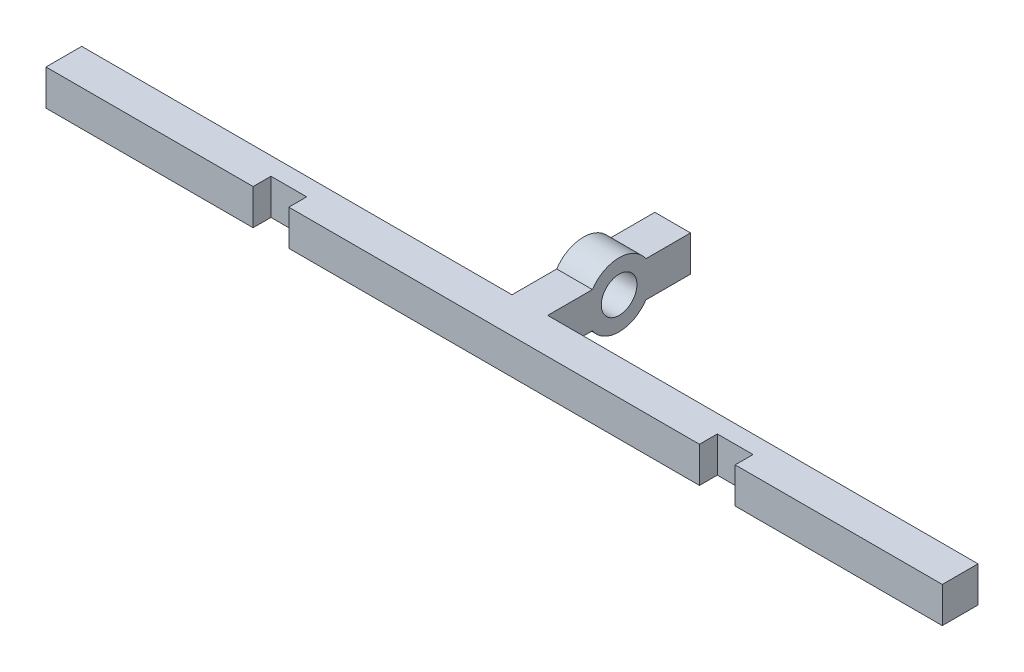
ISO-10303-21;
HEADER;
FILE_DESCRIPTION(('STEP AP214'),'2;1');
FILE_NAME('part.step','',(''),(''),'','','');
FILE_SCHEMA(('AUTOMOTIVE_DESIGN { 1 0 10303 214 1 1 1 1 }'));
ENDSEC;
DATA;
#1=APPLICATION_CONTEXT('core data for automotive mechanical design processes');
#2=APPLICATION_PROTOCOL_DEFINITION('international standard','automotive_design',2000,#1);
#3=PRODUCT_CONTEXT('',#1,'mechanical');
#4=PRODUCT('Part','Part','',(#3));
#5=PRODUCT_RELATED_PRODUCT_CATEGORY('part','',(#4));
#6=PRODUCT_DEFINITION_FORMATION('','',#4);
#7=PRODUCT_DEFINITION_CONTEXT('part definition',#1,'design');
#8=PRODUCT_DEFINITION('design','',#6,#7);
#9=PRODUCT_DEFINITION_SHAPE('','',#8);
#10=(LENGTH_UNIT() NAMED_UNIT(*) SI_UNIT(.MILLI.,.METRE.));
#11=(NAMED_UNIT(*) PLANE_ANGLE_UNIT() SI_UNIT($,.RADIAN.));
#12=(NAMED_UNIT(*) SI_UNIT($,.STERADIAN.) SOLID_ANGLE_UNIT());
#13=UNCERTAINTY_MEASURE_WITH_UNIT(LENGTH_MEASURE(1.E-05),#10,'distance_accuracy_value','');
#14=(GEOMETRIC_REPRESENTATION_CONTEXT(3) GLOBAL_UNCERTAINTY_ASSIGNED_CONTEXT((#13)) GLOBAL_UNIT_ASSIGNED_CONTEXT((#10,
#11,#12)) REPRESENTATION_CONTEXT('',''));
#15=CARTESIAN_POINT('',(0.,0.,0.));
#16=DIRECTION('',(0.,0.,1.));
#17=DIRECTION('',(1.,0.,0.));
#18=AXIS2_PLACEMENT_3D('',#15,#16,#17);
#19=CARTESIAN_POINT('',(-95.0441558772843,4.99999999999998,-20.));
#20=DIRECTION('',(-1.,0.,0.));
#21=DIRECTION('',(0.,0.,1.));
#22=AXIS2_PLACEMENT_3D('',#19,#20,#21);
#23=CYLINDRICAL_SURFACE('',#22,9.);
#24=CARTESIAN_POINT('',(-130.5,4.99999999999998,-20.));
#25=DIRECTION('',(-1.,0.,0.));
#26=DIRECTION('',(0.,0.,1.));
#27=AXIS2_PLACEMENT_3D('',#24,#25,#26);
#28=CIRCLE('',#27,9.);
#29=CARTESIAN_POINT('',(-130.5,0.,-27.4833147735479));
#30=VERTEX_POINT('',#29);
#31=CARTESIAN_POINT('',(-130.5,0.,-12.5166852264521));
#32=VERTEX_POINT('',#31);
#33=EDGE_CURVE('E59',#30,#32,#28,.T.);
#34=ORIENTED_EDGE('',*,*,#33,.F.);
#35=DIRECTION('',(-1.,0.,0.));
#36=VECTOR('',#35,1.);
#37=CARTESIAN_POINT('',(-95.0441558772843,0.,-27.4833147735479));
#38=LINE('',#37,#36);
#39=CARTESIAN_POINT('',(-120.5,0.,-27.4833147735479));
#40=VERTEX_POINT('',#39);
#41=EDGE_CURVE('E11',#30,#40,#38,.F.);
#42=ORIENTED_EDGE('',*,*,#41,.T.);
#43=CARTESIAN_POINT('',(-120.5,4.99999999999998,-20.));
#44=DIRECTION('',(-1.,0.,0.));
#45=DIRECTION('',(0.,-1.,0.));
#46=AXIS2_PLACEMENT_3D('',#43,#44,#45);
#47=CIRCLE('',#46,9.);
#48=CARTESIAN_POINT('',(-120.5,0.,-12.5166852264521));
#49=VERTEX_POINT('',#48);
#50=EDGE_CURVE('E198',#49,#40,#47,.F.);
#51=ORIENTED_EDGE('',*,*,#50,.F.);
#52=DIRECTION('',(-1.,0.,0.));
#53=VECTOR('',#52,1.);
#54=CARTESIAN_POINT('',(-95.0441558772843,0.,-12.5166852264521));
#55=LINE('',#54,#53);
#56=EDGE_CURVE('E200',#32,#49,#55,.F.);
#57=ORIENTED_EDGE('',*,*,#56,.F.);
#58=EDGE_LOOP('',(#34,#42,#51,#57));
#59=FACE_BOUND('',#58,.T.);
#60=ADVANCED_FACE('F36',(#59),#23,.T.);
#61=CARTESIAN_POINT('',(-120.5,9.99999999999998,-27.4833147735479));
#62=VERTEX_POINT('',#61);
#63=CARTESIAN_POINT('',(-120.5,9.99999999999998,-12.5166852264521));
#64=VERTEX_POINT('',#63);
#65=EDGE_CURVE('E201',#62,#64,#47,.F.);
#66=ORIENTED_EDGE('',*,*,#65,.F.);
#67=DIRECTION('',(-1.,0.,0.));
#68=VECTOR('',#67,1.);
#69=CARTESIAN_POINT('',(-95.0441558772843,9.99999999999999,-27.4833147735479));
#70=LINE('',#69,#68);
#71=CARTESIAN_POINT('',(-130.5,9.99999999999999,-27.4833147735479));
#72=VERTEX_POINT('',#71);
#73=EDGE_CURVE('E44',#62,#72,#70,.T.);
#74=ORIENTED_EDGE('',*,*,#73,.T.);
#75=CARTESIAN_POINT('',(-130.5,9.99999999999998,-12.5166852264521));
#76=VERTEX_POINT('',#75);
#77=EDGE_CURVE('E191',#76,#72,#28,.T.);
#78=ORIENTED_EDGE('',*,*,#77,.F.);
#79=DIRECTION('',(-1.,0.,0.));
#80=VECTOR('',#79,1.);
#81=CARTESIAN_POINT('',(-95.0441558772843,9.99999999999999,-12.5166852264521));
#82=LINE('',#81,#80);
#83=EDGE_CURVE('E317',#64,#76,#82,.T.);
#84=ORIENTED_EDGE('',*,*,#83,.F.);
#85=EDGE_LOOP('',(#66,#74,#78,#84));
#86=FACE_BOUND('',#85,.T.);
#87=ADVANCED_FACE('F321',(#86),#23,.T.);
#88=CARTESIAN_POINT('',(0.,0.,10.));
#89=DIRECTION('',(0.,1.,0.));
#90=DIRECTION('',(-1.,0.,0.));
#91=AXIS2_PLACEMENT_3D('',#88,#89,#90);
#92=PLANE('',#91);
#93=DIRECTION('',(0.,0.,1.));
#94=VECTOR('',#93,1.);
#95=CARTESIAN_POINT('',(-130.5,0.,-40.));
#96=LINE('',#95,#94);
#97=CARTESIAN_POINT('',(-130.5,0.,0.));
#98=VERTEX_POINT('',#97);
#99=EDGE_CURVE('E233',#32,#98,#96,.T.);
#100=ORIENTED_EDGE('',*,*,#99,.F.);
#101=ORIENTED_EDGE('',*,*,#56,.T.);
#102=DIRECTION('',(0.,0.,1.));
#103=VECTOR('',#102,1.);
#104=CARTESIAN_POINT('',(-120.5,0.,-40.));
#105=LINE('',#104,#103);
#106=CARTESIAN_POINT('',(-120.5,0.,0.));
#107=VERTEX_POINT('',#106);
#108=EDGE_CURVE('E205',#49,#107,#105,.T.);
#109=ORIENTED_EDGE('',*,*,#108,.T.);
#110=DIRECTION('',(1.,0.,0.));
#111=VECTOR('',#110,1.);
#112=CARTESIAN_POINT('',(0.,0.,0.));
#113=LINE('',#112,#111);
#114=CARTESIAN_POINT('',(0.,0.,0.));
#115=VERTEX_POINT('',#114);
#116=EDGE_CURVE('E234',#107,#115,#113,.T.);
#117=ORIENTED_EDGE('',*,*,#116,.T.);
#118=DIRECTION('',(0.,0.,-1.));
#119=VECTOR('',#118,1.);
#120=CARTESIAN_POINT('',(0.,0.,10.));
#121=LINE('',#120,#119);
#122=CARTESIAN_POINT('',(0.,0.,10.));
#123=VERTEX_POINT('',#122);
#124=EDGE_CURVE('E226',#123,#115,#121,.T.);
#125=ORIENTED_EDGE('',*,*,#124,.F.);
#126=DIRECTION('',(1.,0.,0.));
#127=VECTOR('',#126,1.);
#128=CARTESIAN_POINT('',(0.,0.,10.));
#129=LINE('',#128,#127);
#130=CARTESIAN_POINT('',(-58.,0.,10.));
#131=VERTEX_POINT('',#130);
#132=EDGE_CURVE('E245',#131,#123,#129,.T.);
#133=ORIENTED_EDGE('',*,*,#132,.F.);
#134=DIRECTION('',(0.,0.,1.));
#135=VECTOR('',#134,1.);
#136=CARTESIAN_POINT('',(-58.,0.,5.));
#137=LINE('',#136,#135);
#138=CARTESIAN_POINT('',(-58.,0.,5.));
#139=VERTEX_POINT('',#138);
#140=EDGE_CURVE('E265',#139,#131,#137,.T.);
#141=ORIENTED_EDGE('',*,*,#140,.F.);
#142=DIRECTION('',(1.,0.,0.));
#143=VECTOR('',#142,1.);
#144=CARTESIAN_POINT('',(-58.,0.,5.));
#145=LINE('',#144,#143);
#146=CARTESIAN_POINT('',(-68.,0.,5.));
#147=VERTEX_POINT('',#146);
#148=EDGE_CURVE('E270',#147,#139,#145,.T.);
#149=ORIENTED_EDGE('',*,*,#148,.F.);
#150=DIRECTION('',(0.,0.,1.));
#151=VECTOR('',#150,1.);
#152=CARTESIAN_POINT('',(-68.,0.,5.));
#153=LINE('',#152,#151);
#154=CARTESIAN_POINT('',(-68.,0.,10.));
#155=VERTEX_POINT('',#154);
#156=EDGE_CURVE('E262',#147,#155,#153,.T.);
#157=ORIENTED_EDGE('',*,*,#156,.T.);
#158=CARTESIAN_POINT('',(-183.,0.,10.));
#159=VERTEX_POINT('',#158);
#160=EDGE_CURVE('E219',#159,#155,#129,.T.);
#161=ORIENTED_EDGE('',*,*,#160,.F.);
#162=DIRECTION('',(0.,0.,1.));
#163=VECTOR('',#162,1.);
#164=CARTESIAN_POINT('',(-183.,0.,5.));
#165=LINE('',#164,#163);
#166=CARTESIAN_POINT('',(-183.,0.,5.));
#167=VERTEX_POINT('',#166);
#168=EDGE_CURVE('E284',#167,#159,#165,.T.);
#169=ORIENTED_EDGE('',*,*,#168,.F.);
#170=DIRECTION('',(1.,0.,0.));
#171=VECTOR('',#170,1.);
#172=CARTESIAN_POINT('',(-193.,0.,5.));
#173=LINE('',#172,#171);
#174=CARTESIAN_POINT('',(-193.,0.,5.));
#175=VERTEX_POINT('',#174);
#176=EDGE_CURVE('E301',#175,#167,#173,.T.);
#177=ORIENTED_EDGE('',*,*,#176,.F.);
#178=DIRECTION('',(0.,0.,1.));
#179=VECTOR('',#178,1.);
#180=CARTESIAN_POINT('',(-193.,0.,5.));
#181=LINE('',#180,#179);
#182=CARTESIAN_POINT('',(-193.,0.,10.));
#183=VERTEX_POINT('',#182);
#184=EDGE_CURVE('E225',#175,#183,#181,.T.);
#185=ORIENTED_EDGE('',*,*,#184,.T.);
#186=CARTESIAN_POINT('',(-251.,0.,10.));
#187=VERTEX_POINT('',#186);
#188=EDGE_CURVE('E242',#187,#183,#129,.T.);
#189=ORIENTED_EDGE('',*,*,#188,.F.);
#190=DIRECTION('',(0.,0.,-1.));
#191=VECTOR('',#190,1.);
#192=CARTESIAN_POINT('',(-251.,0.,10.));
#193=LINE('',#192,#191);
#194=CARTESIAN_POINT('',(-251.,0.,0.));
#195=VERTEX_POINT('',#194);
#196=EDGE_CURVE('E221',#187,#195,#193,.T.);
#197=ORIENTED_EDGE('',*,*,#196,.T.);
#198=EDGE_CURVE('E224',#195,#98,#113,.T.);
#199=ORIENTED_EDGE('',*,*,#198,.T.);
#200=EDGE_LOOP('',(#100,#101,#109,#117,#125,#133,#141,#149,#157,#161,#169,#177,#185,#189,#197,#199));
#201=FACE_BOUND('',#200,.T.);
#202=ADVANCED_FACE('F339',(#201),#92,.F.);
#203=CARTESIAN_POINT('',(-130.5,0.,-40.));
#204=DIRECTION('',(1.,0.,0.));
#205=DIRECTION('',(0.,0.,-1.));
#206=AXIS2_PLACEMENT_3D('',#203,#204,#205);
#207=PLANE('',#206);
#208=CARTESIAN_POINT('',(-130.5,4.99999999999998,-20.));
#209=DIRECTION('',(-1.,0.,0.));
#210=DIRECTION('',(0.,0.,1.));
#211=AXIS2_PLACEMENT_3D('',#208,#209,#210);
#212=CIRCLE('',#211,5.);
#213=CARTESIAN_POINT('',(-130.5,4.99999999999998,-15.));
#214=VERTEX_POINT('',#213);
#215=EDGE_CURVE('E297',#214,#214,#212,.T.);
#216=ORIENTED_EDGE('',*,*,#215,.F.);
#217=EDGE_LOOP('',(#216));
#218=FACE_BOUND('',#217,.T.);
#219=DIRECTION('',(0.,0.,1.));
#220=VECTOR('',#219,1.);
#221=CARTESIAN_POINT('',(-130.5,0.,-40.));
#222=LINE('',#221,#220);
#223=CARTESIAN_POINT('',(-130.5,0.,-40.));
#224=VERTEX_POINT('',#223);
#225=EDGE_CURVE('E328',#224,#30,#222,.T.);
#226=ORIENTED_EDGE('',*,*,#225,.T.);
#227=ORIENTED_EDGE('',*,*,#33,.T.);
#228=ORIENTED_EDGE('',*,*,#99,.T.);
#229=DIRECTION('',(0.,1.,0.));
#230=VECTOR('',#229,1.);
#231=CARTESIAN_POINT('',(-130.5,0.,0.));
#232=LINE('',#231,#230);
#233=CARTESIAN_POINT('',(-130.5,9.99999999999998,0.));
#234=VERTEX_POINT('',#233);
#235=EDGE_CURVE('E210',#98,#234,#232,.T.);
#236=ORIENTED_EDGE('',*,*,#235,.T.);
#237=DIRECTION('',(0.,0.,1.));
#238=VECTOR('',#237,1.);
#239=CARTESIAN_POINT('',(-130.5,9.99999999999998,-40.));
#240=LINE('',#239,#238);
#241=EDGE_CURVE('E229',#76,#234,#240,.T.);
#242=ORIENTED_EDGE('',*,*,#241,.F.);
#243=ORIENTED_EDGE('',*,*,#77,.T.);
#244=DIRECTION('',(0.,0.,1.));
#245=VECTOR('',#244,1.);
#246=CARTESIAN_POINT('',(-130.5,9.99999999999998,-40.));
#247=LINE('',#246,#245);
#248=CARTESIAN_POINT('',(-130.5,9.99999999999998,-40.));
#249=VERTEX_POINT('',#248);
#250=EDGE_CURVE('E51',#249,#72,#247,.T.);
#251=ORIENTED_EDGE('',*,*,#250,.F.);
#252=DIRECTION('',(0.,1.,0.));
#253=VECTOR('',#252,1.);
#254=CARTESIAN_POINT('',(-130.5,0.,-40.));
#255=LINE('',#254,#253);
#256=EDGE_CURVE('E180',#224,#249,#255,.T.);
#257=ORIENTED_EDGE('',*,*,#256,.F.);
#258=EDGE_LOOP('',(#226,#227,#228,#236,#242,#243,#251,#257));
#259=FACE_BOUND('',#258,.T.);
#260=ADVANCED_FACE('F189',(#218,#259),#207,.F.);
#261=CARTESIAN_POINT('',(-120.5,0.,-40.));
#262=DIRECTION('',(-1.,0.,0.));
#263=DIRECTION('',(0.,-1.,0.));
#264=AXIS2_PLACEMENT_3D('',#261,#262,#263);
#265=PLANE('',#264);
#266=ORIENTED_EDGE('',*,*,#50,.T.);
#267=DIRECTION('',(0.,0.,1.));
#268=VECTOR('',#267,1.);
#269=CARTESIAN_POINT('',(-120.5,0.,-40.));
#270=LINE('',#269,#268);
#271=CARTESIAN_POINT('',(-120.5,0.,-40.));
#272=VERTEX_POINT('',#271);
#273=EDGE_CURVE('E194',#272,#40,#270,.T.);
#274=ORIENTED_EDGE('',*,*,#273,.F.);
#275=DIRECTION('',(0.,-1.,0.));
#276=VECTOR('',#275,1.);
#277=CARTESIAN_POINT('',(-120.5,0.,-40.));
#278=LINE('',#277,#276);
#279=CARTESIAN_POINT('',(-120.5,9.99999999999998,-40.));
#280=VERTEX_POINT('',#279);
#281=EDGE_CURVE('E179',#280,#272,#278,.T.);
#282=ORIENTED_EDGE('',*,*,#281,.F.);
#283=DIRECTION('',(0.,0.,1.));
#284=VECTOR('',#283,1.);
#285=CARTESIAN_POINT('',(-120.5,9.99999999999998,-40.));
#286=LINE('',#285,#284);
#287=EDGE_CURVE('E176',#280,#62,#286,.T.);
#288=ORIENTED_EDGE('',*,*,#287,.T.);
#289=ORIENTED_EDGE('',*,*,#65,.T.);
#290=DIRECTION('',(0.,0.,1.));
#291=VECTOR('',#290,1.);
#292=CARTESIAN_POINT('',(-120.5,9.99999999999998,-40.));
#293=LINE('',#292,#291);
#294=CARTESIAN_POINT('',(-120.5,9.99999999999998,0.));
#295=VERTEX_POINT('',#294);
#296=EDGE_CURVE('E209',#64,#295,#293,.T.);
#297=ORIENTED_EDGE('',*,*,#296,.T.);
#298=DIRECTION('',(0.,-1.,0.));
#299=VECTOR('',#298,1.);
#300=CARTESIAN_POINT('',(-120.5,0.,0.));
#301=LINE('',#300,#299);
#302=EDGE_CURVE('E306',#295,#107,#301,.T.);
#303=ORIENTED_EDGE('',*,*,#302,.T.);
#304=ORIENTED_EDGE('',*,*,#108,.F.);
#305=EDGE_LOOP('',(#266,#274,#282,#288,#289,#297,#303,#304));
#306=FACE_BOUND('',#305,.T.);
#307=CARTESIAN_POINT('',(-120.5,4.99999999999998,-20.));
#308=DIRECTION('',(-1.,0.,0.));
#309=DIRECTION('',(0.,-1.,0.));
#310=AXIS2_PLACEMENT_3D('',#307,#308,#309);
#311=CIRCLE('',#310,5.);
#312=CARTESIAN_POINT('',(-120.5,0.,-20.));
#313=VERTEX_POINT('',#312);
#314=EDGE_CURVE('E206',#313,#313,#311,.T.);
#315=ORIENTED_EDGE('',*,*,#314,.T.);
#316=EDGE_LOOP('',(#315));
#317=FACE_BOUND('',#316,.T.);
#318=ADVANCED_FACE('F324',(#306,#317),#265,.F.);
#319=CARTESIAN_POINT('',(0.,0.,0.));
#320=DIRECTION('',(0.,0.,1.));
#321=DIRECTION('',(1.,0.,0.));
#322=AXIS2_PLACEMENT_3D('',#319,#320,#321);
#323=PLANE('',#322);
#324=ORIENTED_EDGE('',*,*,#235,.F.);
#325=ORIENTED_EDGE('',*,*,#198,.F.);
#326=DIRECTION('',(0.,-1.,0.));
#327=VECTOR('',#326,1.);
#328=CARTESIAN_POINT('',(-251.,0.,0.));
#329=LINE('',#328,#327);
#330=CARTESIAN_POINT('',(-251.,9.99999999999997,0.));
#331=VERTEX_POINT('',#330);
#332=EDGE_CURVE('E220',#331,#195,#329,.T.);
#333=ORIENTED_EDGE('',*,*,#332,.F.);
#334=DIRECTION('',(-1.,0.,0.));
#335=VECTOR('',#334,1.);
#336=CARTESIAN_POINT('',(0.,10.,0.));
#337=LINE('',#336,#335);
#338=EDGE_CURVE('E238',#234,#331,#337,.T.);
#339=ORIENTED_EDGE('',*,*,#338,.F.);
#340=EDGE_LOOP('',(#324,#325,#333,#339));
#341=FACE_BOUND('',#340,.T.);
#342=ADVANCED_FACE('F344',(#341),#323,.F.);
#343=ORIENTED_EDGE('',*,*,#302,.F.);
#344=CARTESIAN_POINT('',(0.,10.,0.));
#345=VERTEX_POINT('',#344);
#346=EDGE_CURVE('E214',#345,#295,#337,.T.);
#347=ORIENTED_EDGE('',*,*,#346,.F.);
#348=DIRECTION('',(0.,1.,0.));
#349=VECTOR('',#348,1.);
#350=CARTESIAN_POINT('',(0.,0.,0.));
#351=LINE('',#350,#349);
#352=EDGE_CURVE('E230',#115,#345,#351,.T.);
#353=ORIENTED_EDGE('',*,*,#352,.F.);
#354=ORIENTED_EDGE('',*,*,#116,.F.);
#355=EDGE_LOOP('',(#343,#347,#353,#354));
#356=FACE_BOUND('',#355,.T.);
#357=ADVANCED_FACE('F419',(#356),#323,.F.);
#358=CARTESIAN_POINT('',(0.,0.,10.));
#359=DIRECTION('',(0.,0.,1.));
#360=DIRECTION('',(1.,0.,0.));
#361=AXIS2_PLACEMENT_3D('',#358,#359,#360);
#362=PLANE('',#361);
#363=DIRECTION('',(0.,-1.,0.));
#364=VECTOR('',#363,1.);
#365=CARTESIAN_POINT('',(-193.,10.,10.));
#366=LINE('',#365,#364);
#367=CARTESIAN_POINT('',(-193.,10.,10.));
#368=VERTEX_POINT('',#367);
#369=EDGE_CURVE('E273',#368,#183,#366,.T.);
#370=ORIENTED_EDGE('',*,*,#369,.F.);
#371=DIRECTION('',(-1.,0.,0.));
#372=VECTOR('',#371,1.);
#373=CARTESIAN_POINT('',(0.,10.,10.));
#374=LINE('',#373,#372);
#375=CARTESIAN_POINT('',(-251.,9.99999999999997,10.));
#376=VERTEX_POINT('',#375);
#377=EDGE_CURVE('E248',#368,#376,#374,.T.);
#378=ORIENTED_EDGE('',*,*,#377,.T.);
#379=DIRECTION('',(0.,-1.,0.));
#380=VECTOR('',#379,1.);
#381=CARTESIAN_POINT('',(-251.,0.,10.));
#382=LINE('',#381,#380);
#383=EDGE_CURVE('E246',#376,#187,#382,.T.);
#384=ORIENTED_EDGE('',*,*,#383,.T.);
#385=ORIENTED_EDGE('',*,*,#188,.T.);
#386=EDGE_LOOP('',(#370,#378,#384,#385));
#387=FACE_BOUND('',#386,.T.);
#388=ADVANCED_FACE('F358',(#387),#362,.T.);
#389=DIRECTION('',(0.,1.,0.));
#390=VECTOR('',#389,1.);
#391=CARTESIAN_POINT('',(-58.,10.,10.));
#392=LINE('',#391,#390);
#393=CARTESIAN_POINT('',(-58.,10.,10.));
#394=VERTEX_POINT('',#393);
#395=EDGE_CURVE('E267',#131,#394,#392,.T.);
#396=ORIENTED_EDGE('',*,*,#395,.F.);
#397=ORIENTED_EDGE('',*,*,#132,.T.);
#398=DIRECTION('',(0.,1.,0.));
#399=VECTOR('',#398,1.);
#400=CARTESIAN_POINT('',(0.,0.,10.));
#401=LINE('',#400,#399);
#402=CARTESIAN_POINT('',(0.,10.,10.));
#403=VERTEX_POINT('',#402);
#404=EDGE_CURVE('E251',#123,#403,#401,.T.);
#405=ORIENTED_EDGE('',*,*,#404,.T.);
#406=EDGE_CURVE('E241',#403,#394,#374,.T.);
#407=ORIENTED_EDGE('',*,*,#406,.T.);
#408=EDGE_LOOP('',(#396,#397,#405,#407));
#409=FACE_BOUND('',#408,.T.);
#410=ADVANCED_FACE('F371',(#409),#362,.T.);
#411=CARTESIAN_POINT('',(0.,0.,10.));
#412=DIRECTION('',(-1.,0.,0.));
#413=DIRECTION('',(0.,0.,1.));
#414=AXIS2_PLACEMENT_3D('',#411,#412,#413);
#415=PLANE('',#414);
#416=ORIENTED_EDGE('',*,*,#352,.T.);
#417=DIRECTION('',(0.,0.,-1.));
#418=VECTOR('',#417,1.);
#419=CARTESIAN_POINT('',(0.,10.,10.));
#420=LINE('',#419,#418);
#421=EDGE_CURVE('E211',#403,#345,#420,.T.);
#422=ORIENTED_EDGE('',*,*,#421,.F.);
#423=ORIENTED_EDGE('',*,*,#404,.F.);
#424=ORIENTED_EDGE('',*,*,#124,.T.);
#425=EDGE_LOOP('',(#416,#422,#423,#424));
#426=FACE_BOUND('',#425,.T.);
#427=ADVANCED_FACE('F377',(#426),#415,.F.);
#428=CARTESIAN_POINT('',(0.,10.,10.));
#429=DIRECTION('',(0.,-1.,0.));
#430=DIRECTION('',(1.,0.,0.));
#431=AXIS2_PLACEMENT_3D('',#428,#429,#430);
#432=PLANE('',#431);
#433=ORIENTED_EDGE('',*,*,#296,.F.);
#434=ORIENTED_EDGE('',*,*,#83,.T.);
#435=ORIENTED_EDGE('',*,*,#241,.T.);
#436=ORIENTED_EDGE('',*,*,#338,.T.);
#437=DIRECTION('',(0.,0.,-1.));
#438=VECTOR('',#437,1.);
#439=CARTESIAN_POINT('',(-251.,9.99999999999997,10.));
#440=LINE('',#439,#438);
#441=EDGE_CURVE('E216',#376,#331,#440,.T.);
#442=ORIENTED_EDGE('',*,*,#441,.F.);
#443=ORIENTED_EDGE('',*,*,#377,.F.);
#444=DIRECTION('',(0.,0.,1.));
#445=VECTOR('',#444,1.);
#446=CARTESIAN_POINT('',(-193.,10.,5.));
#447=LINE('',#446,#445);
#448=CARTESIAN_POINT('',(-193.,10.,5.));
#449=VERTEX_POINT('',#448);
#450=EDGE_CURVE('E290',#449,#368,#447,.T.);
#451=ORIENTED_EDGE('',*,*,#450,.F.);
#452=DIRECTION('',(-1.,0.,0.));
#453=VECTOR('',#452,1.);
#454=CARTESIAN_POINT('',(-193.,10.,5.));
#455=LINE('',#454,#453);
#456=CARTESIAN_POINT('',(-183.,10.,5.));
#457=VERTEX_POINT('',#456);
#458=EDGE_CURVE('E294',#457,#449,#455,.T.);
#459=ORIENTED_EDGE('',*,*,#458,.F.);
#460=DIRECTION('',(0.,0.,1.));
#461=VECTOR('',#460,1.);
#462=CARTESIAN_POINT('',(-183.,10.,5.));
#463=LINE('',#462,#461);
#464=CARTESIAN_POINT('',(-183.,10.,10.));
#465=VERTEX_POINT('',#464);
#466=EDGE_CURVE('E257',#457,#465,#463,.T.);
#467=ORIENTED_EDGE('',*,*,#466,.T.);
#468=CARTESIAN_POINT('',(-68.,9.99999999999999,10.));
#469=VERTEX_POINT('',#468);
#470=EDGE_CURVE('E252',#469,#465,#374,.T.);
#471=ORIENTED_EDGE('',*,*,#470,.F.);
#472=DIRECTION('',(0.,0.,1.));
#473=VECTOR('',#472,1.);
#474=CARTESIAN_POINT('',(-68.,10.,5.));
#475=LINE('',#474,#473);
#476=CARTESIAN_POINT('',(-68.,10.,5.));
#477=VERTEX_POINT('',#476);
#478=EDGE_CURVE('E258',#477,#469,#475,.T.);
#479=ORIENTED_EDGE('',*,*,#478,.F.);
#480=DIRECTION('',(-1.,0.,0.));
#481=VECTOR('',#480,1.);
#482=CARTESIAN_POINT('',(-58.,10.,5.));
#483=LINE('',#482,#481);
#484=CARTESIAN_POINT('',(-58.,10.,5.));
#485=VERTEX_POINT('',#484);
#486=EDGE_CURVE('E277',#485,#477,#483,.T.);
#487=ORIENTED_EDGE('',*,*,#486,.F.);
#488=DIRECTION('',(0.,0.,1.));
#489=VECTOR('',#488,1.);
#490=CARTESIAN_POINT('',(-58.,10.,5.));
#491=LINE('',#490,#489);
#492=EDGE_CURVE('E215',#485,#394,#491,.T.);
#493=ORIENTED_EDGE('',*,*,#492,.T.);
#494=ORIENTED_EDGE('',*,*,#406,.F.);
#495=ORIENTED_EDGE('',*,*,#421,.T.);
#496=ORIENTED_EDGE('',*,*,#346,.T.);
#497=EDGE_LOOP('',(#433,#434,#435,#436,#442,#443,#451,#459,#467,#471,#479,#487,#493,#494,#495,#496));
#498=FACE_BOUND('',#497,.T.);
#499=ADVANCED_FACE('F349',(#498),#432,.F.);
#500=CARTESIAN_POINT('',(-251.,0.,10.));
#501=DIRECTION('',(1.,0.,0.));
#502=DIRECTION('',(0.,0.,-1.));
#503=AXIS2_PLACEMENT_3D('',#500,#501,#502);
#504=PLANE('',#503);
#505=ORIENTED_EDGE('',*,*,#332,.T.);
#506=ORIENTED_EDGE('',*,*,#196,.F.);
#507=ORIENTED_EDGE('',*,*,#383,.F.);
#508=ORIENTED_EDGE('',*,*,#441,.T.);
#509=EDGE_LOOP('',(#505,#506,#507,#508));
#510=FACE_BOUND('',#509,.T.);
#511=ADVANCED_FACE('F353',(#510),#504,.F.);
#512=DIRECTION('',(0.,1.,0.));
#513=VECTOR('',#512,1.);
#514=CARTESIAN_POINT('',(-183.,10.,10.));
#515=LINE('',#514,#513);
#516=EDGE_CURVE('E287',#159,#465,#515,.T.);
#517=ORIENTED_EDGE('',*,*,#516,.F.);
#518=ORIENTED_EDGE('',*,*,#160,.T.);
#519=DIRECTION('',(0.,-1.,0.));
#520=VECTOR('',#519,1.);
#521=CARTESIAN_POINT('',(-68.,10.,10.));
#522=LINE('',#521,#520);
#523=EDGE_CURVE('E261',#469,#155,#522,.T.);
#524=ORIENTED_EDGE('',*,*,#523,.F.);
#525=ORIENTED_EDGE('',*,*,#470,.T.);
#526=EDGE_LOOP('',(#517,#518,#524,#525));
#527=FACE_BOUND('',#526,.T.);
#528=ADVANCED_FACE('F388',(#527),#362,.T.);
#529=CARTESIAN_POINT('',(-58.,10.,5.));
#530=DIRECTION('',(1.,0.,0.));
#531=DIRECTION('',(0.,0.,-1.));
#532=AXIS2_PLACEMENT_3D('',#529,#530,#531);
#533=PLANE('',#532);
#534=ORIENTED_EDGE('',*,*,#395,.T.);
#535=ORIENTED_EDGE('',*,*,#492,.F.);
#536=DIRECTION('',(0.,1.,0.));
#537=VECTOR('',#536,1.);
#538=CARTESIAN_POINT('',(-58.,10.,5.));
#539=LINE('',#538,#537);
#540=EDGE_CURVE('E260',#139,#485,#539,.T.);
#541=ORIENTED_EDGE('',*,*,#540,.F.);
#542=ORIENTED_EDGE('',*,*,#140,.T.);
#543=EDGE_LOOP('',(#534,#535,#541,#542));
#544=FACE_BOUND('',#543,.T.);
#545=ADVANCED_FACE('F381',(#544),#533,.F.);
#546=CARTESIAN_POINT('',(-68.,10.,5.));
#547=DIRECTION('',(-1.,0.,0.));
#548=DIRECTION('',(0.,0.,1.));
#549=AXIS2_PLACEMENT_3D('',#546,#547,#548);
#550=PLANE('',#549);
#551=ORIENTED_EDGE('',*,*,#523,.T.);
#552=ORIENTED_EDGE('',*,*,#156,.F.);
#553=DIRECTION('',(0.,-1.,0.));
#554=VECTOR('',#553,1.);
#555=CARTESIAN_POINT('',(-68.,10.,5.));
#556=LINE('',#555,#554);
#557=EDGE_CURVE('E274',#477,#147,#556,.T.);
#558=ORIENTED_EDGE('',*,*,#557,.F.);
#559=ORIENTED_EDGE('',*,*,#478,.T.);
#560=EDGE_LOOP('',(#551,#552,#558,#559));
#561=FACE_BOUND('',#560,.T.);
#562=ADVANCED_FACE('F387',(#561),#550,.F.);
#563=CARTESIAN_POINT('',(0.,0.,5.));
#564=DIRECTION('',(0.,0.,-1.));
#565=DIRECTION('',(-1.,0.,0.));
#566=AXIS2_PLACEMENT_3D('',#563,#564,#565);
#567=PLANE('',#566);
#568=ORIENTED_EDGE('',*,*,#540,.T.);
#569=ORIENTED_EDGE('',*,*,#486,.T.);
#570=ORIENTED_EDGE('',*,*,#557,.T.);
#571=ORIENTED_EDGE('',*,*,#148,.T.);
#572=EDGE_LOOP('',(#568,#569,#570,#571));
#573=FACE_BOUND('',#572,.T.);
#574=ADVANCED_FACE('F383',(#573),#567,.F.);
#575=CARTESIAN_POINT('',(-193.,10.,5.));
#576=DIRECTION('',(-1.,0.,0.));
#577=DIRECTION('',(0.,0.,1.));
#578=AXIS2_PLACEMENT_3D('',#575,#576,#577);
#579=PLANE('',#578);
#580=ORIENTED_EDGE('',*,*,#369,.T.);
#581=ORIENTED_EDGE('',*,*,#184,.F.);
#582=DIRECTION('',(0.,-1.,0.));
#583=VECTOR('',#582,1.);
#584=CARTESIAN_POINT('',(-193.,10.,5.));
#585=LINE('',#584,#583);
#586=EDGE_CURVE('E286',#449,#175,#585,.T.);
#587=ORIENTED_EDGE('',*,*,#586,.F.);
#588=ORIENTED_EDGE('',*,*,#450,.T.);
#589=EDGE_LOOP('',(#580,#581,#587,#588));
#590=FACE_BOUND('',#589,.T.);
#591=ADVANCED_FACE('F396',(#590),#579,.F.);
#592=CARTESIAN_POINT('',(-183.,10.,5.));
#593=DIRECTION('',(1.,0.,0.));
#594=DIRECTION('',(0.,0.,-1.));
#595=AXIS2_PLACEMENT_3D('',#592,#593,#594);
#596=PLANE('',#595);
#597=ORIENTED_EDGE('',*,*,#516,.T.);
#598=ORIENTED_EDGE('',*,*,#466,.F.);
#599=DIRECTION('',(0.,1.,0.));
#600=VECTOR('',#599,1.);
#601=CARTESIAN_POINT('',(-183.,10.,5.));
#602=LINE('',#601,#600);
#603=EDGE_CURVE('E298',#167,#457,#602,.T.);
#604=ORIENTED_EDGE('',*,*,#603,.F.);
#605=ORIENTED_EDGE('',*,*,#168,.T.);
#606=EDGE_LOOP('',(#597,#598,#604,#605));
#607=FACE_BOUND('',#606,.T.);
#608=ADVANCED_FACE('F391',(#607),#596,.F.);
#609=CARTESIAN_POINT('',(0.,0.,5.));
#610=DIRECTION('',(0.,0.,1.));
#611=DIRECTION('',(1.,0.,0.));
#612=AXIS2_PLACEMENT_3D('',#609,#610,#611);
#613=PLANE('',#612);
#614=ORIENTED_EDGE('',*,*,#586,.T.);
#615=ORIENTED_EDGE('',*,*,#176,.T.);
#616=ORIENTED_EDGE('',*,*,#603,.T.);
#617=ORIENTED_EDGE('',*,*,#458,.T.);
#618=EDGE_LOOP('',(#614,#615,#616,#617));
#619=FACE_BOUND('',#618,.T.);
#620=ADVANCED_FACE('F393',(#619),#613,.T.);
#621=CARTESIAN_POINT('',(0.001000000000001,4.99999999999998,-20.));
#622=DIRECTION('',(-1.,0.,0.));
#623=DIRECTION('',(0.,0.,1.));
#624=AXIS2_PLACEMENT_3D('',#621,#622,#623);
#625=CYLINDRICAL_SURFACE('',#624,5.);
#626=ORIENTED_EDGE('',*,*,#314,.F.);
#627=EDGE_LOOP('',(#626));
#628=FACE_BOUND('',#627,.T.);
#629=ORIENTED_EDGE('',*,*,#215,.T.);
#630=EDGE_LOOP('',(#629));
#631=FACE_BOUND('',#630,.T.);
#632=ADVANCED_FACE('F38',(#628,#631),#625,.F.);
#633=CARTESIAN_POINT('',(0.,0.,-40.));
#634=DIRECTION('',(0.,0.,1.));
#635=DIRECTION('',(1.,0.,0.));
#636=AXIS2_PLACEMENT_3D('',#633,#634,#635);
#637=PLANE('',#636);
#638=ORIENTED_EDGE('',*,*,#256,.T.);
#639=DIRECTION('',(1.,0.,0.));
#640=VECTOR('',#639,1.);
#641=CARTESIAN_POINT('',(-120.5,9.99999999999998,-40.));
#642=LINE('',#641,#640);
#643=EDGE_CURVE('E172',#249,#280,#642,.T.);
#644=ORIENTED_EDGE('',*,*,#643,.T.);
#645=ORIENTED_EDGE('',*,*,#281,.T.);
#646=DIRECTION('',(-1.,0.,0.));
#647=VECTOR('',#646,1.);
#648=CARTESIAN_POINT('',(-120.5,0.,-40.));
#649=LINE('',#648,#647);
#650=EDGE_CURVE('E185',#272,#224,#649,.T.);
#651=ORIENTED_EDGE('',*,*,#650,.T.);
#652=EDGE_LOOP('',(#638,#644,#645,#651));
#653=FACE_BOUND('',#652,.T.);
#654=ADVANCED_FACE('F183',(#653),#637,.F.);
#655=CARTESIAN_POINT('',(0.,0.,10.));
#656=DIRECTION('',(0.,1.,0.));
#657=DIRECTION('',(-1.,0.,0.));
#658=AXIS2_PLACEMENT_3D('',#655,#656,#657);
#659=PLANE('',#658);
#660=ORIENTED_EDGE('',*,*,#41,.F.);
#661=ORIENTED_EDGE('',*,*,#225,.F.);
#662=ORIENTED_EDGE('',*,*,#650,.F.);
#663=ORIENTED_EDGE('',*,*,#273,.T.);
#664=EDGE_LOOP('',(#660,#661,#662,#663));
#665=FACE_BOUND('',#664,.T.);
#666=ADVANCED_FACE('F332',(#665),#659,.F.);
#667=CARTESIAN_POINT('',(0.,10.,10.));
#668=DIRECTION('',(0.,-1.,0.));
#669=DIRECTION('',(1.,0.,0.));
#670=AXIS2_PLACEMENT_3D('',#667,#668,#669);
#671=PLANE('',#670);
#672=ORIENTED_EDGE('',*,*,#73,.F.);
#673=ORIENTED_EDGE('',*,*,#287,.F.);
#674=ORIENTED_EDGE('',*,*,#643,.F.);
#675=ORIENTED_EDGE('',*,*,#250,.T.);
#676=EDGE_LOOP('',(#672,#673,#674,#675));
#677=FACE_BOUND('',#676,.T.);
#678=ADVANCED_FACE('F174',(#677),#671,.F.);
#679=CLOSED_SHELL('',(#60,#87,#202,#260,#318,#342,#357,#388,#410,#427,#499,#511,#528,#545,#562,
#574,#591,#608,#620,#632,#654,#666,#678));
#680=MANIFOLD_SOLID_BREP('B2',#679);
#681=ADVANCED_BREP_SHAPE_REPRESENTATION('',(#18,#680),#14);
#682=SHAPE_DEFINITION_REPRESENTATION(#9,#681);
ENDSEC;
END-ISO-10303-21;
